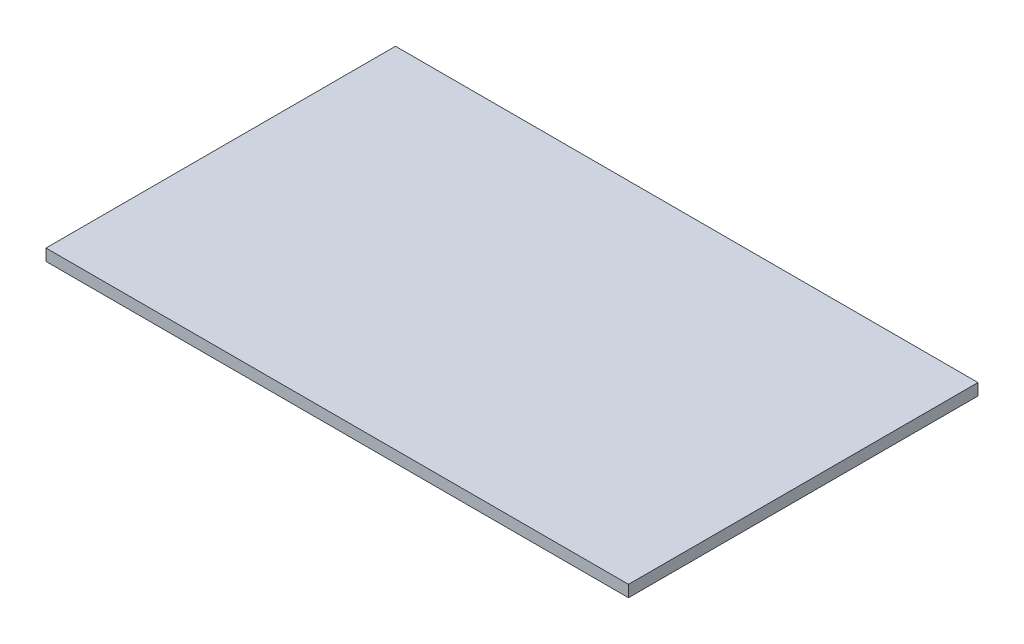
ISO-10303-21;
HEADER;
FILE_DESCRIPTION(('STEP AP214'),'2;1');
FILE_NAME('part.step','',(''),(''),'','','');
FILE_SCHEMA(('AUTOMOTIVE_DESIGN { 1 0 10303 214 1 1 1 1 }'));
ENDSEC;
DATA;
#1=APPLICATION_CONTEXT('core data for automotive mechanical design processes');
#2=APPLICATION_PROTOCOL_DEFINITION('international standard','automotive_design',2000,#1);
#3=PRODUCT_CONTEXT('',#1,'mechanical');
#4=PRODUCT('Part','Part','',(#3));
#5=PRODUCT_RELATED_PRODUCT_CATEGORY('part','',(#4));
#6=PRODUCT_DEFINITION_FORMATION('','',#4);
#7=PRODUCT_DEFINITION_CONTEXT('part definition',#1,'design');
#8=PRODUCT_DEFINITION('design','',#6,#7);
#9=PRODUCT_DEFINITION_SHAPE('','',#8);
#10=(LENGTH_UNIT() NAMED_UNIT(*) SI_UNIT(.MILLI.,.METRE.));
#11=(NAMED_UNIT(*) PLANE_ANGLE_UNIT() SI_UNIT($,.RADIAN.));
#12=(NAMED_UNIT(*) SI_UNIT($,.STERADIAN.) SOLID_ANGLE_UNIT());
#13=UNCERTAINTY_MEASURE_WITH_UNIT(LENGTH_MEASURE(1.E-05),#10,'distance_accuracy_value','');
#14=(GEOMETRIC_REPRESENTATION_CONTEXT(3) GLOBAL_UNCERTAINTY_ASSIGNED_CONTEXT((#13)) GLOBAL_UNIT_ASSIGNED_CONTEXT((#10,
#11,#12)) REPRESENTATION_CONTEXT('',''));
#15=CARTESIAN_POINT('',(0.,0.,0.));
#16=DIRECTION('',(0.,0.,1.));
#17=DIRECTION('',(1.,0.,0.));
#18=AXIS2_PLACEMENT_3D('',#15,#16,#17);
#19=CARTESIAN_POINT('',(-54.3841668746658,10.,-257.537485469781));
#20=DIRECTION('',(1.,0.,0.));
#21=DIRECTION('',(0.,0.,-1.));
#22=AXIS2_PLACEMENT_3D('',#19,#20,#21);
#23=PLANE('',#22);
#24=DIRECTION('',(0.,0.,1.));
#25=VECTOR('',#24,1.);
#26=CARTESIAN_POINT('',(-54.3841668746658,0.,-257.537485469781));
#27=LINE('',#26,#25);
#28=CARTESIAN_POINT('',(-54.3841668746658,0.,-257.537485469781));
#29=VERTEX_POINT('',#28);
#30=CARTESIAN_POINT('',(-54.3841668746657,0.,42.4625145302193));
#31=VERTEX_POINT('',#30);
#32=EDGE_CURVE('E96',#29,#31,#27,.T.);
#33=ORIENTED_EDGE('',*,*,#32,.T.);
#34=DIRECTION('',(0.,-1.,0.));
#35=VECTOR('',#34,1.);
#36=CARTESIAN_POINT('',(-54.3841668746657,10.,42.4625145302193));
#37=LINE('',#36,#35);
#38=CARTESIAN_POINT('',(-54.3841668746657,10.,42.4625145302193));
#39=VERTEX_POINT('',#38);
#40=EDGE_CURVE('E11',#39,#31,#37,.T.);
#41=ORIENTED_EDGE('',*,*,#40,.F.);
#42=DIRECTION('',(0.,0.,1.));
#43=VECTOR('',#42,1.);
#44=CARTESIAN_POINT('',(-54.3841668746658,10.,-257.537485469781));
#45=LINE('',#44,#43);
#46=CARTESIAN_POINT('',(-54.3841668746658,10.,-257.537485469781));
#47=VERTEX_POINT('',#46);
#48=EDGE_CURVE('E84',#47,#39,#45,.T.);
#49=ORIENTED_EDGE('',*,*,#48,.F.);
#50=DIRECTION('',(0.,-1.,0.));
#51=VECTOR('',#50,1.);
#52=CARTESIAN_POINT('',(-54.3841668746658,10.,-257.537485469781));
#53=LINE('',#52,#51);
#54=EDGE_CURVE('E92',#47,#29,#53,.T.);
#55=ORIENTED_EDGE('',*,*,#54,.T.);
#56=EDGE_LOOP('',(#33,#41,#49,#55));
#57=FACE_BOUND('',#56,.T.);
#58=ADVANCED_FACE('F33',(#57),#23,.F.);
#59=CARTESIAN_POINT('',(-54.3841668746657,10.,42.4625145302193));
#60=DIRECTION('',(0.,0.,-1.));
#61=DIRECTION('',(-1.,0.,0.));
#62=AXIS2_PLACEMENT_3D('',#59,#60,#61);
#63=PLANE('',#62);
#64=DIRECTION('',(1.,0.,0.));
#65=VECTOR('',#64,1.);
#66=CARTESIAN_POINT('',(-54.3841668746657,0.,42.4625145302193));
#67=LINE('',#66,#65);
#68=CARTESIAN_POINT('',(445.615833125334,0.,42.4625145302193));
#69=VERTEX_POINT('',#68);
#70=EDGE_CURVE('E88',#31,#69,#67,.T.);
#71=ORIENTED_EDGE('',*,*,#70,.T.);
#72=DIRECTION('',(0.,-1.,0.));
#73=VECTOR('',#72,1.);
#74=CARTESIAN_POINT('',(445.615833125334,10.,42.4625145302193));
#75=LINE('',#74,#73);
#76=CARTESIAN_POINT('',(445.615833125334,10.,42.4625145302193));
#77=VERTEX_POINT('',#76);
#78=EDGE_CURVE('E41',#77,#69,#75,.T.);
#79=ORIENTED_EDGE('',*,*,#78,.F.);
#80=DIRECTION('',(1.,0.,0.));
#81=VECTOR('',#80,1.);
#82=CARTESIAN_POINT('',(-54.3841668746657,10.,42.4625145302193));
#83=LINE('',#82,#81);
#84=EDGE_CURVE('E79',#39,#77,#83,.T.);
#85=ORIENTED_EDGE('',*,*,#84,.F.);
#86=ORIENTED_EDGE('',*,*,#40,.T.);
#87=EDGE_LOOP('',(#71,#79,#85,#86));
#88=FACE_BOUND('',#87,.T.);
#89=ADVANCED_FACE('F87',(#88),#63,.F.);
#90=CARTESIAN_POINT('',(445.615833125334,10.,-257.537485469781));
#91=DIRECTION('',(-1.,0.,0.));
#92=DIRECTION('',(0.,0.,1.));
#93=AXIS2_PLACEMENT_3D('',#90,#91,#92);
#94=PLANE('',#93);
#95=DIRECTION('',(0.,0.,-1.));
#96=VECTOR('',#95,1.);
#97=CARTESIAN_POINT('',(445.615833125334,0.,-257.537485469781));
#98=LINE('',#97,#96);
#99=CARTESIAN_POINT('',(445.615833125334,0.,-257.537485469781));
#100=VERTEX_POINT('',#99);
#101=EDGE_CURVE('E66',#69,#100,#98,.T.);
#102=ORIENTED_EDGE('',*,*,#101,.T.);
#103=DIRECTION('',(0.,-1.,0.));
#104=VECTOR('',#103,1.);
#105=CARTESIAN_POINT('',(445.615833125334,10.,-257.537485469781));
#106=LINE('',#105,#104);
#107=CARTESIAN_POINT('',(445.615833125334,10.,-257.537485469781));
#108=VERTEX_POINT('',#107);
#109=EDGE_CURVE('E89',#108,#100,#106,.T.);
#110=ORIENTED_EDGE('',*,*,#109,.F.);
#111=DIRECTION('',(0.,0.,-1.));
#112=VECTOR('',#111,1.);
#113=CARTESIAN_POINT('',(445.615833125334,10.,-257.537485469781));
#114=LINE('',#113,#112);
#115=EDGE_CURVE('E82',#77,#108,#114,.T.);
#116=ORIENTED_EDGE('',*,*,#115,.F.);
#117=ORIENTED_EDGE('',*,*,#78,.T.);
#118=EDGE_LOOP('',(#102,#110,#116,#117));
#119=FACE_BOUND('',#118,.T.);
#120=ADVANCED_FACE('F90',(#119),#94,.F.);
#121=CARTESIAN_POINT('',(-54.3841668746658,10.,-257.537485469781));
#122=DIRECTION('',(0.,0.,1.));
#123=DIRECTION('',(1.,0.,0.));
#124=AXIS2_PLACEMENT_3D('',#121,#122,#123);
#125=PLANE('',#124);
#126=DIRECTION('',(-1.,0.,0.));
#127=VECTOR('',#126,1.);
#128=CARTESIAN_POINT('',(-54.3841668746658,0.,-257.537485469781));
#129=LINE('',#128,#127);
#130=EDGE_CURVE('E72',#100,#29,#129,.T.);
#131=ORIENTED_EDGE('',*,*,#130,.T.);
#132=ORIENTED_EDGE('',*,*,#54,.F.);
#133=DIRECTION('',(-1.,0.,0.));
#134=VECTOR('',#133,1.);
#135=CARTESIAN_POINT('',(-54.3841668746658,10.,-257.537485469781));
#136=LINE('',#135,#134);
#137=EDGE_CURVE('E49',#108,#47,#136,.T.);
#138=ORIENTED_EDGE('',*,*,#137,.F.);
#139=ORIENTED_EDGE('',*,*,#109,.T.);
#140=EDGE_LOOP('',(#131,#132,#138,#139));
#141=FACE_BOUND('',#140,.T.);
#142=ADVANCED_FACE('F103',(#141),#125,.F.);
#143=CARTESIAN_POINT('',(0.,10.,0.));
#144=DIRECTION('',(0.,1.,0.));
#145=DIRECTION('',(0.,0.,1.));
#146=AXIS2_PLACEMENT_3D('',#143,#144,#145);
#147=PLANE('',#146);
#148=ORIENTED_EDGE('',*,*,#48,.T.);
#149=ORIENTED_EDGE('',*,*,#84,.T.);
#150=ORIENTED_EDGE('',*,*,#115,.T.);
#151=ORIENTED_EDGE('',*,*,#137,.T.);
#152=EDGE_LOOP('',(#148,#149,#150,#151));
#153=FACE_BOUND('',#152,.T.);
#154=ADVANCED_FACE('F80',(#153),#147,.T.);
#155=CARTESIAN_POINT('',(0.,0.,0.));
#156=DIRECTION('',(0.,1.,0.));
#157=DIRECTION('',(0.,0.,1.));
#158=AXIS2_PLACEMENT_3D('',#155,#156,#157);
#159=PLANE('',#158);
#160=ORIENTED_EDGE('',*,*,#32,.F.);
#161=ORIENTED_EDGE('',*,*,#130,.F.);
#162=ORIENTED_EDGE('',*,*,#101,.F.);
#163=ORIENTED_EDGE('',*,*,#70,.F.);
#164=EDGE_LOOP('',(#160,#161,#162,#163));
#165=FACE_BOUND('',#164,.T.);
#166=ADVANCED_FACE('F106',(#165),#159,.F.);
#167=CLOSED_SHELL('',(#58,#89,#120,#142,#154,#166));
#168=MANIFOLD_SOLID_BREP('B2',#167);
#169=ADVANCED_BREP_SHAPE_REPRESENTATION('',(#18,#168),#14);
#170=SHAPE_DEFINITION_REPRESENTATION(#9,#169);
ENDSEC;
END-ISO-10303-21;
